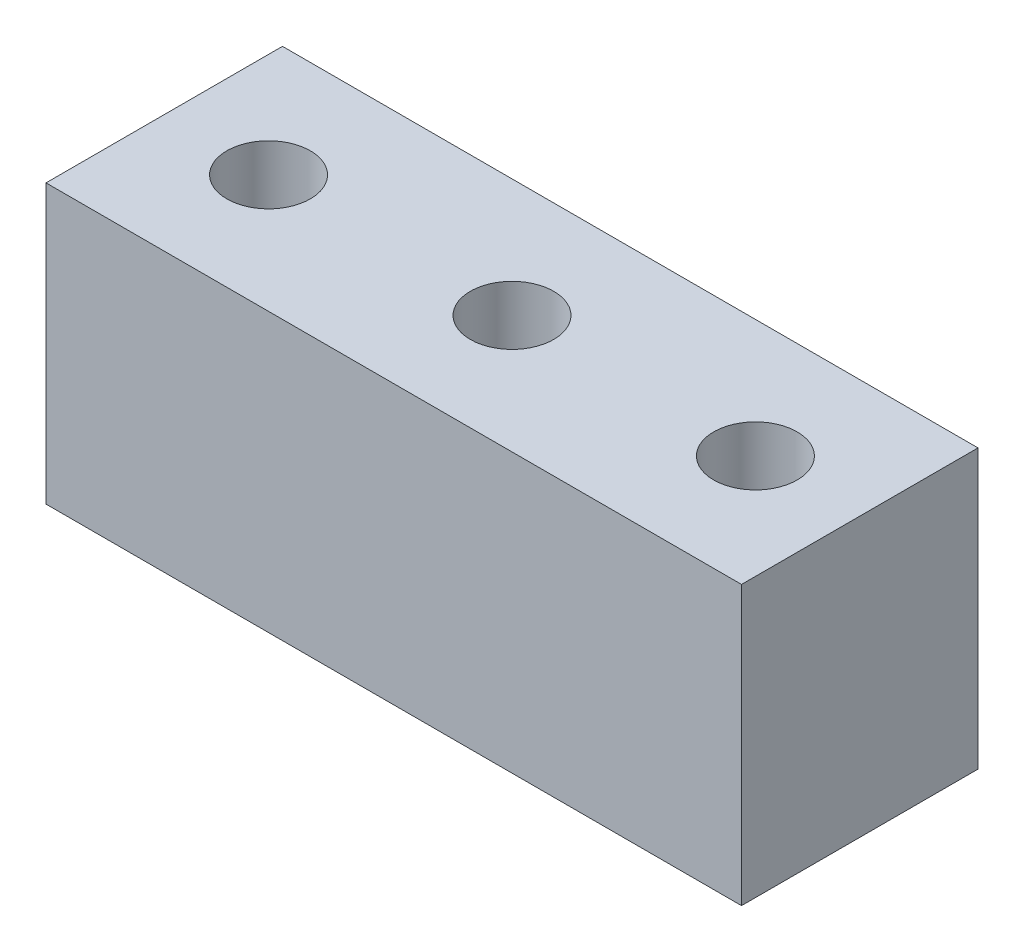
ISO-10303-21;
HEADER;
FILE_DESCRIPTION(('STEP AP214'),'2;1');
FILE_NAME('part.step','',(''),(''),'','','');
FILE_SCHEMA(('AUTOMOTIVE_DESIGN { 1 0 10303 214 1 1 1 1 }'));
ENDSEC;
DATA;
#1=APPLICATION_CONTEXT('core data for automotive mechanical design processes');
#2=APPLICATION_PROTOCOL_DEFINITION('international standard','automotive_design',2000,#1);
#3=PRODUCT_CONTEXT('',#1,'mechanical');
#4=PRODUCT('Part','Part','',(#3));
#5=PRODUCT_RELATED_PRODUCT_CATEGORY('part','',(#4));
#6=PRODUCT_DEFINITION_FORMATION('','',#4);
#7=PRODUCT_DEFINITION_CONTEXT('part definition',#1,'design');
#8=PRODUCT_DEFINITION('design','',#6,#7);
#9=PRODUCT_DEFINITION_SHAPE('','',#8);
#10=(LENGTH_UNIT() NAMED_UNIT(*) SI_UNIT(.MILLI.,.METRE.));
#11=(NAMED_UNIT(*) PLANE_ANGLE_UNIT() SI_UNIT($,.RADIAN.));
#12=(NAMED_UNIT(*) SI_UNIT($,.STERADIAN.) SOLID_ANGLE_UNIT());
#13=UNCERTAINTY_MEASURE_WITH_UNIT(LENGTH_MEASURE(1.E-05),#10,'distance_accuracy_value','');
#14=(GEOMETRIC_REPRESENTATION_CONTEXT(3) GLOBAL_UNCERTAINTY_ASSIGNED_CONTEXT((#13)) GLOBAL_UNIT_ASSIGNED_CONTEXT((#10,
#11,#12)) REPRESENTATION_CONTEXT('',''));
#15=CARTESIAN_POINT('',(0.,0.,0.));
#16=DIRECTION('',(0.,0.,1.));
#17=DIRECTION('',(1.,0.,0.));
#18=AXIS2_PLACEMENT_3D('',#15,#16,#17);
#19=CARTESIAN_POINT('',(50.,40.,17.));
#20=DIRECTION('',(-1.,0.,0.));
#21=DIRECTION('',(0.,0.,1.));
#22=AXIS2_PLACEMENT_3D('',#19,#20,#21);
#23=PLANE('',#22);
#24=DIRECTION('',(0.,0.,-1.));
#25=VECTOR('',#24,1.);
#26=CARTESIAN_POINT('',(50.,0.,17.));
#27=LINE('',#26,#25);
#28=CARTESIAN_POINT('',(50.,0.,17.));
#29=VERTEX_POINT('',#28);
#30=CARTESIAN_POINT('',(50.,0.,-17.));
#31=VERTEX_POINT('',#30);
#32=EDGE_CURVE('E80',#29,#31,#27,.T.);
#33=ORIENTED_EDGE('',*,*,#32,.T.);
#34=DIRECTION('',(0.,-1.,0.));
#35=VECTOR('',#34,1.);
#36=CARTESIAN_POINT('',(50.,40.,-17.));
#37=LINE('',#36,#35);
#38=CARTESIAN_POINT('',(50.,40.,-17.));
#39=VERTEX_POINT('',#38);
#40=EDGE_CURVE('E11',#39,#31,#37,.T.);
#41=ORIENTED_EDGE('',*,*,#40,.F.);
#42=DIRECTION('',(0.,0.,-1.));
#43=VECTOR('',#42,1.);
#44=CARTESIAN_POINT('',(50.,40.,17.));
#45=LINE('',#44,#43);
#46=CARTESIAN_POINT('',(50.,40.,17.));
#47=VERTEX_POINT('',#46);
#48=EDGE_CURVE('E68',#47,#39,#45,.T.);
#49=ORIENTED_EDGE('',*,*,#48,.F.);
#50=DIRECTION('',(0.,-1.,0.));
#51=VECTOR('',#50,1.);
#52=CARTESIAN_POINT('',(50.,40.,17.));
#53=LINE('',#52,#51);
#54=EDGE_CURVE('E76',#47,#29,#53,.T.);
#55=ORIENTED_EDGE('',*,*,#54,.T.);
#56=EDGE_LOOP('',(#33,#41,#49,#55));
#57=FACE_BOUND('',#56,.T.);
#58=ADVANCED_FACE('F17',(#57),#23,.F.);
#59=CARTESIAN_POINT('',(-50.,40.,-17.));
#60=DIRECTION('',(0.,0.,1.));
#61=DIRECTION('',(1.,0.,0.));
#62=AXIS2_PLACEMENT_3D('',#59,#60,#61);
#63=PLANE('',#62);
#64=DIRECTION('',(-1.,0.,0.));
#65=VECTOR('',#64,1.);
#66=CARTESIAN_POINT('',(-50.,0.,-17.));
#67=LINE('',#66,#65);
#68=CARTESIAN_POINT('',(-50.,0.,-17.));
#69=VERTEX_POINT('',#68);
#70=EDGE_CURVE('E72',#31,#69,#67,.T.);
#71=ORIENTED_EDGE('',*,*,#70,.T.);
#72=DIRECTION('',(0.,-1.,0.));
#73=VECTOR('',#72,1.);
#74=CARTESIAN_POINT('',(-50.,40.,-17.));
#75=LINE('',#74,#73);
#76=CARTESIAN_POINT('',(-50.,40.,-17.));
#77=VERTEX_POINT('',#76);
#78=EDGE_CURVE('E25',#77,#69,#75,.T.);
#79=ORIENTED_EDGE('',*,*,#78,.F.);
#80=DIRECTION('',(-1.,0.,0.));
#81=VECTOR('',#80,1.);
#82=CARTESIAN_POINT('',(-50.,40.,-17.));
#83=LINE('',#82,#81);
#84=EDGE_CURVE('E63',#39,#77,#83,.T.);
#85=ORIENTED_EDGE('',*,*,#84,.F.);
#86=ORIENTED_EDGE('',*,*,#40,.T.);
#87=EDGE_LOOP('',(#71,#79,#85,#86));
#88=FACE_BOUND('',#87,.T.);
#89=ADVANCED_FACE('F71',(#88),#63,.F.);
#90=CARTESIAN_POINT('',(-50.,40.,17.));
#91=DIRECTION('',(1.,0.,0.));
#92=DIRECTION('',(0.,0.,-1.));
#93=AXIS2_PLACEMENT_3D('',#90,#91,#92);
#94=PLANE('',#93);
#95=DIRECTION('',(0.,0.,1.));
#96=VECTOR('',#95,1.);
#97=CARTESIAN_POINT('',(-50.,0.,17.));
#98=LINE('',#97,#96);
#99=CARTESIAN_POINT('',(-50.,0.,17.));
#100=VERTEX_POINT('',#99);
#101=EDGE_CURVE('E50',#69,#100,#98,.T.);
#102=ORIENTED_EDGE('',*,*,#101,.T.);
#103=DIRECTION('',(0.,-1.,0.));
#104=VECTOR('',#103,1.);
#105=CARTESIAN_POINT('',(-50.,40.,17.));
#106=LINE('',#105,#104);
#107=CARTESIAN_POINT('',(-50.,40.,17.));
#108=VERTEX_POINT('',#107);
#109=EDGE_CURVE('E73',#108,#100,#106,.T.);
#110=ORIENTED_EDGE('',*,*,#109,.F.);
#111=DIRECTION('',(0.,0.,1.));
#112=VECTOR('',#111,1.);
#113=CARTESIAN_POINT('',(-50.,40.,17.));
#114=LINE('',#113,#112);
#115=EDGE_CURVE('E66',#77,#108,#114,.T.);
#116=ORIENTED_EDGE('',*,*,#115,.F.);
#117=ORIENTED_EDGE('',*,*,#78,.T.);
#118=EDGE_LOOP('',(#102,#110,#116,#117));
#119=FACE_BOUND('',#118,.T.);
#120=ADVANCED_FACE('F74',(#119),#94,.F.);
#121=CARTESIAN_POINT('',(-50.,40.,17.));
#122=DIRECTION('',(0.,0.,-1.));
#123=DIRECTION('',(-1.,0.,0.));
#124=AXIS2_PLACEMENT_3D('',#121,#122,#123);
#125=PLANE('',#124);
#126=DIRECTION('',(1.,0.,0.));
#127=VECTOR('',#126,1.);
#128=CARTESIAN_POINT('',(-50.,0.,17.));
#129=LINE('',#128,#127);
#130=EDGE_CURVE('E56',#100,#29,#129,.T.);
#131=ORIENTED_EDGE('',*,*,#130,.T.);
#132=ORIENTED_EDGE('',*,*,#54,.F.);
#133=DIRECTION('',(1.,0.,0.));
#134=VECTOR('',#133,1.);
#135=CARTESIAN_POINT('',(-50.,40.,17.));
#136=LINE('',#135,#134);
#137=EDGE_CURVE('E33',#108,#47,#136,.T.);
#138=ORIENTED_EDGE('',*,*,#137,.F.);
#139=ORIENTED_EDGE('',*,*,#109,.T.);
#140=EDGE_LOOP('',(#131,#132,#138,#139));
#141=FACE_BOUND('',#140,.T.);
#142=ADVANCED_FACE('F88',(#141),#125,.F.);
#143=CARTESIAN_POINT('',(0.,40.,0.));
#144=DIRECTION('',(0.,-1.,0.));
#145=DIRECTION('',(0.,0.,-1.));
#146=AXIS2_PLACEMENT_3D('',#143,#144,#145);
#147=PLANE('',#146);
#148=CARTESIAN_POINT('',(35.,40.,0.));
#149=DIRECTION('',(0.,1.,0.));
#150=DIRECTION('',(0.,0.,1.));
#151=AXIS2_PLACEMENT_3D('',#148,#149,#150);
#152=CIRCLE('',#151,6.);
#153=CARTESIAN_POINT('',(35.,40.,5.99999999999992));
#154=VERTEX_POINT('',#153);
#155=EDGE_CURVE('E108',#154,#154,#152,.T.);
#156=ORIENTED_EDGE('',*,*,#155,.F.);
#157=EDGE_LOOP('',(#156));
#158=FACE_BOUND('',#157,.T.);
#159=CARTESIAN_POINT('',(0.,40.,0.));
#160=DIRECTION('',(0.,1.,0.));
#161=DIRECTION('',(0.,0.,1.));
#162=AXIS2_PLACEMENT_3D('',#159,#160,#161);
#163=CIRCLE('',#162,6.);
#164=CARTESIAN_POINT('',(0.,40.,5.99999999999992));
#165=VERTEX_POINT('',#164);
#166=EDGE_CURVE('E102',#165,#165,#163,.T.);
#167=ORIENTED_EDGE('',*,*,#166,.F.);
#168=EDGE_LOOP('',(#167));
#169=FACE_BOUND('',#168,.T.);
#170=CARTESIAN_POINT('',(-35.,40.,0.));
#171=DIRECTION('',(0.,1.,0.));
#172=DIRECTION('',(0.,0.,1.));
#173=AXIS2_PLACEMENT_3D('',#170,#171,#172);
#174=CIRCLE('',#173,6.);
#175=CARTESIAN_POINT('',(-35.,40.,5.9999999999999));
#176=VERTEX_POINT('',#175);
#177=EDGE_CURVE('E96',#176,#176,#174,.T.);
#178=ORIENTED_EDGE('',*,*,#177,.F.);
#179=EDGE_LOOP('',(#178));
#180=FACE_BOUND('',#179,.T.);
#181=ORIENTED_EDGE('',*,*,#48,.T.);
#182=ORIENTED_EDGE('',*,*,#84,.T.);
#183=ORIENTED_EDGE('',*,*,#115,.T.);
#184=ORIENTED_EDGE('',*,*,#137,.T.);
#185=EDGE_LOOP('',(#181,#182,#183,#184));
#186=FACE_BOUND('',#185,.T.);
#187=ADVANCED_FACE('F64',(#158,#169,#180,#186),#147,.F.);
#188=CARTESIAN_POINT('',(0.,0.,0.));
#189=DIRECTION('',(0.,-1.,0.));
#190=DIRECTION('',(0.,0.,-1.));
#191=AXIS2_PLACEMENT_3D('',#188,#189,#190);
#192=PLANE('',#191);
#193=CARTESIAN_POINT('',(35.,0.,0.));
#194=DIRECTION('',(0.,1.,0.));
#195=DIRECTION('',(0.,0.,1.));
#196=AXIS2_PLACEMENT_3D('',#193,#194,#195);
#197=CIRCLE('',#196,6.);
#198=CARTESIAN_POINT('',(35.,0.,5.99999999999992));
#199=VERTEX_POINT('',#198);
#200=EDGE_CURVE('E105',#199,#199,#197,.T.);
#201=ORIENTED_EDGE('',*,*,#200,.T.);
#202=EDGE_LOOP('',(#201));
#203=FACE_BOUND('',#202,.T.);
#204=CARTESIAN_POINT('',(0.,0.,0.));
#205=DIRECTION('',(0.,1.,0.));
#206=DIRECTION('',(0.,0.,1.));
#207=AXIS2_PLACEMENT_3D('',#204,#205,#206);
#208=CIRCLE('',#207,6.);
#209=CARTESIAN_POINT('',(0.,0.,5.99999999999992));
#210=VERTEX_POINT('',#209);
#211=EDGE_CURVE('E99',#210,#210,#208,.T.);
#212=ORIENTED_EDGE('',*,*,#211,.T.);
#213=EDGE_LOOP('',(#212));
#214=FACE_BOUND('',#213,.T.);
#215=CARTESIAN_POINT('',(-35.,0.,0.));
#216=DIRECTION('',(0.,1.,0.));
#217=DIRECTION('',(0.,0.,1.));
#218=AXIS2_PLACEMENT_3D('',#215,#216,#217);
#219=CIRCLE('',#218,6.);
#220=CARTESIAN_POINT('',(-35.,0.,5.9999999999999));
#221=VERTEX_POINT('',#220);
#222=EDGE_CURVE('E83',#221,#221,#219,.T.);
#223=ORIENTED_EDGE('',*,*,#222,.T.);
#224=EDGE_LOOP('',(#223));
#225=FACE_BOUND('',#224,.T.);
#226=ORIENTED_EDGE('',*,*,#32,.F.);
#227=ORIENTED_EDGE('',*,*,#130,.F.);
#228=ORIENTED_EDGE('',*,*,#101,.F.);
#229=ORIENTED_EDGE('',*,*,#70,.F.);
#230=EDGE_LOOP('',(#226,#227,#228,#229));
#231=FACE_BOUND('',#230,.T.);
#232=ADVANCED_FACE('F91',(#203,#214,#225,#231),#192,.T.);
#233=CARTESIAN_POINT('',(-35.,40.,0.));
#234=DIRECTION('',(0.,1.,0.));
#235=DIRECTION('',(0.,0.,1.));
#236=AXIS2_PLACEMENT_3D('',#233,#234,#235);
#237=CYLINDRICAL_SURFACE('',#236,6.);
#238=ORIENTED_EDGE('',*,*,#222,.F.);
#239=EDGE_LOOP('',(#238));
#240=FACE_BOUND('',#239,.T.);
#241=ORIENTED_EDGE('',*,*,#177,.T.);
#242=EDGE_LOOP('',(#241));
#243=FACE_BOUND('',#242,.T.);
#244=ADVANCED_FACE('F121',(#240,#243),#237,.F.);
#245=CARTESIAN_POINT('',(0.,40.,0.));
#246=DIRECTION('',(0.,1.,0.));
#247=DIRECTION('',(0.,0.,1.));
#248=AXIS2_PLACEMENT_3D('',#245,#246,#247);
#249=CYLINDRICAL_SURFACE('',#248,6.);
#250=ORIENTED_EDGE('',*,*,#211,.F.);
#251=EDGE_LOOP('',(#250));
#252=FACE_BOUND('',#251,.T.);
#253=ORIENTED_EDGE('',*,*,#166,.T.);
#254=EDGE_LOOP('',(#253));
#255=FACE_BOUND('',#254,.T.);
#256=ADVANCED_FACE('F123',(#252,#255),#249,.F.);
#257=CARTESIAN_POINT('',(35.,40.,0.));
#258=DIRECTION('',(0.,1.,0.));
#259=DIRECTION('',(0.,0.,1.));
#260=AXIS2_PLACEMENT_3D('',#257,#258,#259);
#261=CYLINDRICAL_SURFACE('',#260,6.);
#262=ORIENTED_EDGE('',*,*,#200,.F.);
#263=EDGE_LOOP('',(#262));
#264=FACE_BOUND('',#263,.T.);
#265=ORIENTED_EDGE('',*,*,#155,.T.);
#266=EDGE_LOOP('',(#265));
#267=FACE_BOUND('',#266,.T.);
#268=ADVANCED_FACE('F112',(#264,#267),#261,.F.);
#269=CLOSED_SHELL('',(#58,#89,#120,#142,#187,#232,#244,#256,#268));
#270=MANIFOLD_SOLID_BREP('B1',#269);
#271=ADVANCED_BREP_SHAPE_REPRESENTATION('',(#18,#270),#14);
#272=SHAPE_DEFINITION_REPRESENTATION(#9,#271);
ENDSEC;
END-ISO-10303-21;
